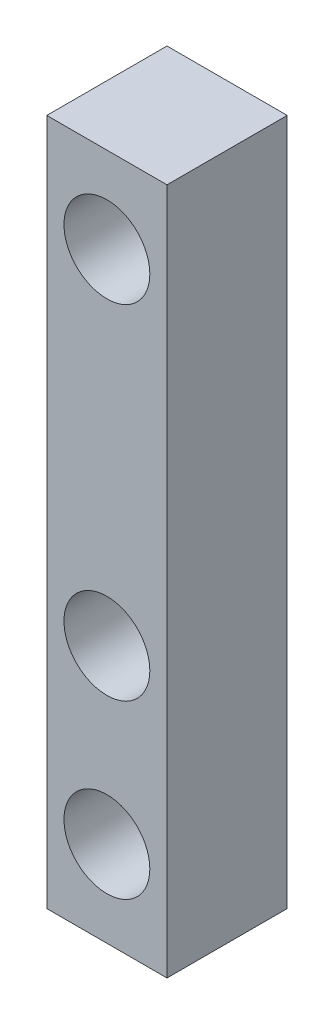
ISO-10303-21;
HEADER;
FILE_DESCRIPTION(('STEP AP214'),'2;1');
FILE_NAME('part.step','',(''),(''),'','','');
FILE_SCHEMA(('AUTOMOTIVE_DESIGN { 1 0 10303 214 1 1 1 1 }'));
ENDSEC;
DATA;
#1=APPLICATION_CONTEXT('core data for automotive mechanical design processes');
#2=APPLICATION_PROTOCOL_DEFINITION('international standard','automotive_design',2000,#1);
#3=PRODUCT_CONTEXT('',#1,'mechanical');
#4=PRODUCT('Part','Part','',(#3));
#5=PRODUCT_RELATED_PRODUCT_CATEGORY('part','',(#4));
#6=PRODUCT_DEFINITION_FORMATION('','',#4);
#7=PRODUCT_DEFINITION_CONTEXT('part definition',#1,'design');
#8=PRODUCT_DEFINITION('design','',#6,#7);
#9=PRODUCT_DEFINITION_SHAPE('','',#8);
#10=(LENGTH_UNIT() NAMED_UNIT(*) SI_UNIT(.MILLI.,.METRE.));
#11=(NAMED_UNIT(*) PLANE_ANGLE_UNIT() SI_UNIT($,.RADIAN.));
#12=(NAMED_UNIT(*) SI_UNIT($,.STERADIAN.) SOLID_ANGLE_UNIT());
#13=UNCERTAINTY_MEASURE_WITH_UNIT(LENGTH_MEASURE(1.E-05),#10,'distance_accuracy_value','');
#14=(GEOMETRIC_REPRESENTATION_CONTEXT(3) GLOBAL_UNCERTAINTY_ASSIGNED_CONTEXT((#13)) GLOBAL_UNIT_ASSIGNED_CONTEXT((#10,
#11,#12)) REPRESENTATION_CONTEXT('',''));
#15=CARTESIAN_POINT('',(0.,0.,0.));
#16=DIRECTION('',(0.,0.,1.));
#17=DIRECTION('',(1.,0.,0.));
#18=AXIS2_PLACEMENT_3D('',#15,#16,#17);
#19=CARTESIAN_POINT('',(0.,0.,7.));
#20=DIRECTION('',(1.,0.,0.));
#21=DIRECTION('',(0.,1.,0.));
#22=AXIS2_PLACEMENT_3D('',#19,#20,#21);
#23=PLANE('',#22);
#24=DIRECTION('',(0.,-1.,0.));
#25=VECTOR('',#24,1.);
#26=CARTESIAN_POINT('',(0.,0.,0.));
#27=LINE('',#26,#25);
#28=CARTESIAN_POINT('',(0.,40.,0.));
#29=VERTEX_POINT('',#28);
#30=CARTESIAN_POINT('',(0.,0.,0.));
#31=VERTEX_POINT('',#30);
#32=EDGE_CURVE('E96',#29,#31,#27,.T.);
#33=ORIENTED_EDGE('',*,*,#32,.T.);
#34=DIRECTION('',(0.,0.,-1.));
#35=VECTOR('',#34,1.);
#36=CARTESIAN_POINT('',(0.,0.,7.));
#37=LINE('',#36,#35);
#38=CARTESIAN_POINT('',(0.,0.,7.));
#39=VERTEX_POINT('',#38);
#40=EDGE_CURVE('E11',#39,#31,#37,.T.);
#41=ORIENTED_EDGE('',*,*,#40,.F.);
#42=DIRECTION('',(0.,-1.,0.));
#43=VECTOR('',#42,1.);
#44=CARTESIAN_POINT('',(0.,0.,7.));
#45=LINE('',#44,#43);
#46=CARTESIAN_POINT('',(0.,40.,7.));
#47=VERTEX_POINT('',#46);
#48=EDGE_CURVE('E84',#47,#39,#45,.T.);
#49=ORIENTED_EDGE('',*,*,#48,.F.);
#50=DIRECTION('',(0.,0.,-1.));
#51=VECTOR('',#50,1.);
#52=CARTESIAN_POINT('',(0.,40.,7.));
#53=LINE('',#52,#51);
#54=EDGE_CURVE('E92',#47,#29,#53,.T.);
#55=ORIENTED_EDGE('',*,*,#54,.T.);
#56=EDGE_LOOP('',(#33,#41,#49,#55));
#57=FACE_BOUND('',#56,.T.);
#58=ADVANCED_FACE('F33',(#57),#23,.F.);
#59=CARTESIAN_POINT('',(0.,0.,7.));
#60=DIRECTION('',(0.,1.,0.));
#61=DIRECTION('',(0.,0.,1.));
#62=AXIS2_PLACEMENT_3D('',#59,#60,#61);
#63=PLANE('',#62);
#64=DIRECTION('',(1.,0.,0.));
#65=VECTOR('',#64,1.);
#66=CARTESIAN_POINT('',(0.,0.,0.));
#67=LINE('',#66,#65);
#68=CARTESIAN_POINT('',(7.,0.,0.));
#69=VERTEX_POINT('',#68);
#70=EDGE_CURVE('E88',#31,#69,#67,.T.);
#71=ORIENTED_EDGE('',*,*,#70,.T.);
#72=DIRECTION('',(0.,0.,-1.));
#73=VECTOR('',#72,1.);
#74=CARTESIAN_POINT('',(7.,0.,7.));
#75=LINE('',#74,#73);
#76=CARTESIAN_POINT('',(7.,0.,7.));
#77=VERTEX_POINT('',#76);
#78=EDGE_CURVE('E41',#77,#69,#75,.T.);
#79=ORIENTED_EDGE('',*,*,#78,.F.);
#80=DIRECTION('',(1.,0.,0.));
#81=VECTOR('',#80,1.);
#82=CARTESIAN_POINT('',(0.,0.,7.));
#83=LINE('',#82,#81);
#84=EDGE_CURVE('E79',#39,#77,#83,.T.);
#85=ORIENTED_EDGE('',*,*,#84,.F.);
#86=ORIENTED_EDGE('',*,*,#40,.T.);
#87=EDGE_LOOP('',(#71,#79,#85,#86));
#88=FACE_BOUND('',#87,.T.);
#89=ADVANCED_FACE('F87',(#88),#63,.F.);
#90=CARTESIAN_POINT('',(7.,0.,7.));
#91=DIRECTION('',(-1.,0.,0.));
#92=DIRECTION('',(0.,-1.,0.));
#93=AXIS2_PLACEMENT_3D('',#90,#91,#92);
#94=PLANE('',#93);
#95=DIRECTION('',(0.,1.,0.));
#96=VECTOR('',#95,1.);
#97=CARTESIAN_POINT('',(7.,0.,0.));
#98=LINE('',#97,#96);
#99=CARTESIAN_POINT('',(6.99999999999999,40.,0.));
#100=VERTEX_POINT('',#99);
#101=EDGE_CURVE('E66',#69,#100,#98,.T.);
#102=ORIENTED_EDGE('',*,*,#101,.T.);
#103=DIRECTION('',(0.,0.,-1.));
#104=VECTOR('',#103,1.);
#105=CARTESIAN_POINT('',(6.99999999999999,40.,7.));
#106=LINE('',#105,#104);
#107=CARTESIAN_POINT('',(6.99999999999999,40.,7.));
#108=VERTEX_POINT('',#107);
#109=EDGE_CURVE('E89',#108,#100,#106,.T.);
#110=ORIENTED_EDGE('',*,*,#109,.F.);
#111=DIRECTION('',(0.,1.,0.));
#112=VECTOR('',#111,1.);
#113=CARTESIAN_POINT('',(7.,0.,7.));
#114=LINE('',#113,#112);
#115=EDGE_CURVE('E82',#77,#108,#114,.T.);
#116=ORIENTED_EDGE('',*,*,#115,.F.);
#117=ORIENTED_EDGE('',*,*,#78,.T.);
#118=EDGE_LOOP('',(#102,#110,#116,#117));
#119=FACE_BOUND('',#118,.T.);
#120=ADVANCED_FACE('F90',(#119),#94,.F.);
#121=CARTESIAN_POINT('',(0.,40.,7.));
#122=DIRECTION('',(0.,-1.,0.));
#123=DIRECTION('',(0.,0.,-1.));
#124=AXIS2_PLACEMENT_3D('',#121,#122,#123);
#125=PLANE('',#124);
#126=DIRECTION('',(-1.,0.,0.));
#127=VECTOR('',#126,1.);
#128=CARTESIAN_POINT('',(0.,40.,0.));
#129=LINE('',#128,#127);
#130=EDGE_CURVE('E72',#100,#29,#129,.T.);
#131=ORIENTED_EDGE('',*,*,#130,.T.);
#132=ORIENTED_EDGE('',*,*,#54,.F.);
#133=DIRECTION('',(-1.,0.,0.));
#134=VECTOR('',#133,1.);
#135=CARTESIAN_POINT('',(0.,40.,7.));
#136=LINE('',#135,#134);
#137=EDGE_CURVE('E49',#108,#47,#136,.T.);
#138=ORIENTED_EDGE('',*,*,#137,.F.);
#139=ORIENTED_EDGE('',*,*,#109,.T.);
#140=EDGE_LOOP('',(#131,#132,#138,#139));
#141=FACE_BOUND('',#140,.T.);
#142=ADVANCED_FACE('F104',(#141),#125,.F.);
#143=CARTESIAN_POINT('',(0.,0.,7.));
#144=DIRECTION('',(0.,0.,-1.));
#145=DIRECTION('',(-1.,0.,0.));
#146=AXIS2_PLACEMENT_3D('',#143,#144,#145);
#147=PLANE('',#146);
#148=CARTESIAN_POINT('',(3.5,5.,7.));
#149=DIRECTION('',(0.,0.,1.));
#150=DIRECTION('',(1.,0.,0.));
#151=AXIS2_PLACEMENT_3D('',#148,#149,#150);
#152=CIRCLE('',#151,2.5);
#153=CARTESIAN_POINT('',(6.,5.,7.));
#154=VERTEX_POINT('',#153);
#155=EDGE_CURVE('E122',#154,#154,#152,.T.);
#156=ORIENTED_EDGE('',*,*,#155,.F.);
#157=EDGE_LOOP('',(#156));
#158=FACE_BOUND('',#157,.T.);
#159=CARTESIAN_POINT('',(3.5,15.,7.));
#160=DIRECTION('',(0.,0.,1.));
#161=DIRECTION('',(1.,0.,0.));
#162=AXIS2_PLACEMENT_3D('',#159,#160,#161);
#163=CIRCLE('',#162,2.5);
#164=CARTESIAN_POINT('',(6.,15.,7.));
#165=VERTEX_POINT('',#164);
#166=EDGE_CURVE('E116',#165,#165,#163,.T.);
#167=ORIENTED_EDGE('',*,*,#166,.F.);
#168=EDGE_LOOP('',(#167));
#169=FACE_BOUND('',#168,.T.);
#170=CARTESIAN_POINT('',(3.49999999999999,35.,7.));
#171=DIRECTION('',(0.,0.,1.));
#172=DIRECTION('',(1.,0.,0.));
#173=AXIS2_PLACEMENT_3D('',#170,#171,#172);
#174=CIRCLE('',#173,2.5);
#175=CARTESIAN_POINT('',(5.99999999999999,35.,7.));
#176=VERTEX_POINT('',#175);
#177=EDGE_CURVE('E110',#176,#176,#174,.T.);
#178=ORIENTED_EDGE('',*,*,#177,.F.);
#179=EDGE_LOOP('',(#178));
#180=FACE_BOUND('',#179,.T.);
#181=ORIENTED_EDGE('',*,*,#48,.T.);
#182=ORIENTED_EDGE('',*,*,#84,.T.);
#183=ORIENTED_EDGE('',*,*,#115,.T.);
#184=ORIENTED_EDGE('',*,*,#137,.T.);
#185=EDGE_LOOP('',(#181,#182,#183,#184));
#186=FACE_BOUND('',#185,.T.);
#187=ADVANCED_FACE('F80',(#158,#169,#180,#186),#147,.F.);
#188=CARTESIAN_POINT('',(0.,0.,0.));
#189=DIRECTION('',(0.,0.,-1.));
#190=DIRECTION('',(-1.,0.,0.));
#191=AXIS2_PLACEMENT_3D('',#188,#189,#190);
#192=PLANE('',#191);
#193=CARTESIAN_POINT('',(3.5,5.,0.));
#194=DIRECTION('',(0.,0.,1.));
#195=DIRECTION('',(1.,0.,0.));
#196=AXIS2_PLACEMENT_3D('',#193,#194,#195);
#197=CIRCLE('',#196,2.5);
#198=CARTESIAN_POINT('',(6.,5.,0.));
#199=VERTEX_POINT('',#198);
#200=EDGE_CURVE('E99',#199,#199,#197,.T.);
#201=ORIENTED_EDGE('',*,*,#200,.T.);
#202=EDGE_LOOP('',(#201));
#203=FACE_BOUND('',#202,.T.);
#204=CARTESIAN_POINT('',(3.5,15.,0.));
#205=DIRECTION('',(0.,0.,1.));
#206=DIRECTION('',(1.,0.,0.));
#207=AXIS2_PLACEMENT_3D('',#204,#205,#206);
#208=CIRCLE('',#207,2.5);
#209=CARTESIAN_POINT('',(6.,15.,0.));
#210=VERTEX_POINT('',#209);
#211=EDGE_CURVE('E119',#210,#210,#208,.T.);
#212=ORIENTED_EDGE('',*,*,#211,.T.);
#213=EDGE_LOOP('',(#212));
#214=FACE_BOUND('',#213,.T.);
#215=CARTESIAN_POINT('',(3.49999999999999,35.,0.));
#216=DIRECTION('',(0.,0.,1.));
#217=DIRECTION('',(1.,0.,0.));
#218=AXIS2_PLACEMENT_3D('',#215,#216,#217);
#219=CIRCLE('',#218,2.5);
#220=CARTESIAN_POINT('',(5.99999999999999,35.,0.));
#221=VERTEX_POINT('',#220);
#222=EDGE_CURVE('E113',#221,#221,#219,.T.);
#223=ORIENTED_EDGE('',*,*,#222,.T.);
#224=EDGE_LOOP('',(#223));
#225=FACE_BOUND('',#224,.T.);
#226=ORIENTED_EDGE('',*,*,#32,.F.);
#227=ORIENTED_EDGE('',*,*,#130,.F.);
#228=ORIENTED_EDGE('',*,*,#101,.F.);
#229=ORIENTED_EDGE('',*,*,#70,.F.);
#230=EDGE_LOOP('',(#226,#227,#228,#229));
#231=FACE_BOUND('',#230,.T.);
#232=ADVANCED_FACE('F107',(#203,#214,#225,#231),#192,.T.);
#233=CARTESIAN_POINT('',(3.49999999999999,35.,0.));
#234=DIRECTION('',(0.,0.,1.));
#235=DIRECTION('',(1.,0.,0.));
#236=AXIS2_PLACEMENT_3D('',#233,#234,#235);
#237=CYLINDRICAL_SURFACE('',#236,2.5);
#238=ORIENTED_EDGE('',*,*,#222,.F.);
#239=EDGE_LOOP('',(#238));
#240=FACE_BOUND('',#239,.T.);
#241=ORIENTED_EDGE('',*,*,#177,.T.);
#242=EDGE_LOOP('',(#241));
#243=FACE_BOUND('',#242,.T.);
#244=ADVANCED_FACE('F144',(#240,#243),#237,.F.);
#245=CARTESIAN_POINT('',(3.5,15.,0.));
#246=DIRECTION('',(0.,0.,1.));
#247=DIRECTION('',(1.,0.,0.));
#248=AXIS2_PLACEMENT_3D('',#245,#246,#247);
#249=CYLINDRICAL_SURFACE('',#248,2.5);
#250=ORIENTED_EDGE('',*,*,#211,.F.);
#251=EDGE_LOOP('',(#250));
#252=FACE_BOUND('',#251,.T.);
#253=ORIENTED_EDGE('',*,*,#166,.T.);
#254=EDGE_LOOP('',(#253));
#255=FACE_BOUND('',#254,.T.);
#256=ADVANCED_FACE('F133',(#252,#255),#249,.F.);
#257=CARTESIAN_POINT('',(3.5,5.,0.));
#258=DIRECTION('',(0.,0.,1.));
#259=DIRECTION('',(1.,0.,0.));
#260=AXIS2_PLACEMENT_3D('',#257,#258,#259);
#261=CYLINDRICAL_SURFACE('',#260,2.5);
#262=ORIENTED_EDGE('',*,*,#200,.F.);
#263=EDGE_LOOP('',(#262));
#264=FACE_BOUND('',#263,.T.);
#265=ORIENTED_EDGE('',*,*,#155,.T.);
#266=EDGE_LOOP('',(#265));
#267=FACE_BOUND('',#266,.T.);
#268=ADVANCED_FACE('F130',(#264,#267),#261,.F.);
#269=CLOSED_SHELL('',(#58,#89,#120,#142,#187,#232,#244,#256,#268));
#270=MANIFOLD_SOLID_BREP('B2',#269);
#271=ADVANCED_BREP_SHAPE_REPRESENTATION('',(#18,#270),#14);
#272=SHAPE_DEFINITION_REPRESENTATION(#9,#271);
ENDSEC;
END-ISO-10303-21;
